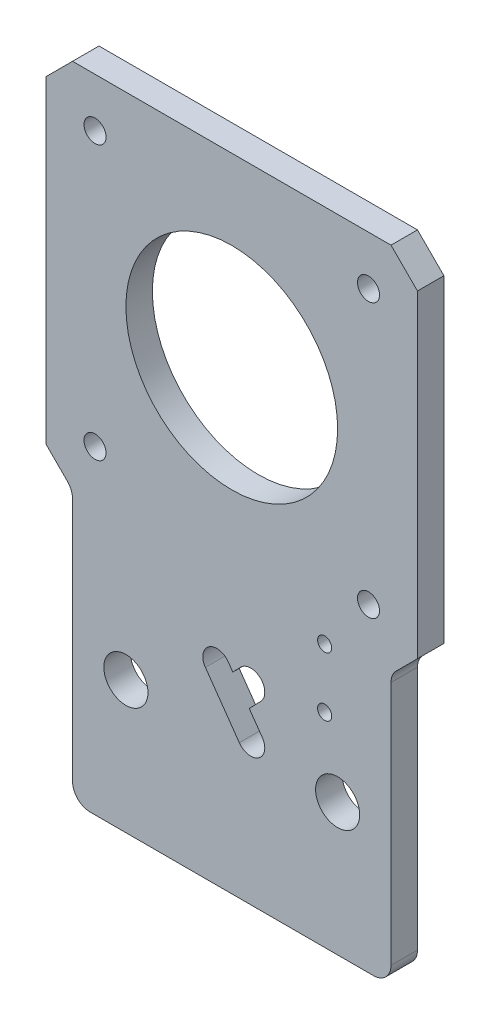
ISO-10303-21;
HEADER;
FILE_DESCRIPTION(('STEP AP214'),'2;1');
FILE_NAME('part.step','',(''),(''),'','','');
FILE_SCHEMA(('AUTOMOTIVE_DESIGN { 1 0 10303 214 1 1 1 1 }'));
ENDSEC;
DATA;
#1=APPLICATION_CONTEXT('core data for automotive mechanical design processes');
#2=APPLICATION_PROTOCOL_DEFINITION('international standard','automotive_design',2000,#1);
#3=PRODUCT_CONTEXT('',#1,'mechanical');
#4=PRODUCT('Part','Part','',(#3));
#5=PRODUCT_RELATED_PRODUCT_CATEGORY('part','',(#4));
#6=PRODUCT_DEFINITION_FORMATION('','',#4);
#7=PRODUCT_DEFINITION_CONTEXT('part definition',#1,'design');
#8=PRODUCT_DEFINITION('design','',#6,#7);
#9=PRODUCT_DEFINITION_SHAPE('','',#8);
#10=(LENGTH_UNIT() NAMED_UNIT(*) SI_UNIT(.MILLI.,.METRE.));
#11=(NAMED_UNIT(*) PLANE_ANGLE_UNIT() SI_UNIT($,.RADIAN.));
#12=(NAMED_UNIT(*) SI_UNIT($,.STERADIAN.) SOLID_ANGLE_UNIT());
#13=UNCERTAINTY_MEASURE_WITH_UNIT(LENGTH_MEASURE(1.E-05),#10,'distance_accuracy_value','');
#14=(GEOMETRIC_REPRESENTATION_CONTEXT(3) GLOBAL_UNCERTAINTY_ASSIGNED_CONTEXT((#13)) GLOBAL_UNIT_ASSIGNED_CONTEXT((#10,
#11,#12)) REPRESENTATION_CONTEXT('',''));
#15=CARTESIAN_POINT('',(0.,0.,0.));
#16=DIRECTION('',(0.,0.,1.));
#17=DIRECTION('',(1.,0.,0.));
#18=AXIS2_PLACEMENT_3D('',#15,#16,#17);
#19=CARTESIAN_POINT('',(0.,0.,3.));
#20=DIRECTION('',(0.,0.,-1.));
#21=DIRECTION('',(-1.,0.,0.));
#22=AXIS2_PLACEMENT_3D('',#19,#20,#21);
#23=PLANE('',#22);
#24=CARTESIAN_POINT('',(0.,-1.11022302462516E-13,3.));
#25=DIRECTION('',(0.,0.,1.));
#26=DIRECTION('',(1.,0.,0.));
#27=AXIS2_PLACEMENT_3D('',#24,#25,#26);
#28=CIRCLE('',#27,12.);
#29=CARTESIAN_POINT('',(12.,-1.11022302462516E-13,3.));
#30=VERTEX_POINT('',#29);
#31=EDGE_CURVE('E295',#30,#30,#28,.T.);
#32=ORIENTED_EDGE('',*,*,#31,.F.);
#33=EDGE_LOOP('',(#32));
#34=FACE_BOUND('',#33,.T.);
#35=DIRECTION('',(1.,0.,0.));
#36=VECTOR('',#35,1.);
#37=CARTESIAN_POINT('',(18.05,-51.6550000000001,3.));
#38=LINE('',#37,#36);
#39=CARTESIAN_POINT('',(-16.05,-51.6550000000001,3.));
#40=VERTEX_POINT('',#39);
#41=CARTESIAN_POINT('',(16.05,-51.6550000000001,3.));
#42=VERTEX_POINT('',#41);
#43=EDGE_CURVE('E311',#40,#42,#38,.T.);
#44=ORIENTED_EDGE('',*,*,#43,.T.);
#45=CARTESIAN_POINT('',(16.05,-49.6550000000001,3.));
#46=DIRECTION('',(0.,0.,-1.));
#47=DIRECTION('',(-1.,0.,0.));
#48=AXIS2_PLACEMENT_3D('',#45,#46,#47);
#49=CIRCLE('',#48,2.);
#50=CARTESIAN_POINT('',(18.05,-49.6550000000001,3.));
#51=VERTEX_POINT('',#50);
#52=EDGE_CURVE('E389',#42,#51,#49,.F.);
#53=ORIENTED_EDGE('',*,*,#52,.T.);
#54=DIRECTION('',(0.,1.,0.));
#55=VECTOR('',#54,1.);
#56=CARTESIAN_POINT('',(18.05,-51.6550000000001,3.));
#57=LINE('',#56,#55);
#58=CARTESIAN_POINT('',(18.05,-21.8784271247463,3.));
#59=VERTEX_POINT('',#58);
#60=EDGE_CURVE('E314',#51,#59,#57,.T.);
#61=ORIENTED_EDGE('',*,*,#60,.T.);
#62=CARTESIAN_POINT('',(20.05,-21.8784271247463,3.));
#63=DIRECTION('',(0.,0.,-1.));
#64=DIRECTION('',(-1.,0.,0.));
#65=AXIS2_PLACEMENT_3D('',#62,#63,#64);
#66=CIRCLE('',#65,2.);
#67=CARTESIAN_POINT('',(18.6357864376269,-20.4642135623732,3.));
#68=VERTEX_POINT('',#67);
#69=EDGE_CURVE('E400',#59,#68,#66,.T.);
#70=ORIENTED_EDGE('',*,*,#69,.T.);
#71=DIRECTION('',(0.707106781186547,0.707106781186548,0.));
#72=VECTOR('',#71,1.);
#73=CARTESIAN_POINT('',(18.05,-21.0500000000001,3.));
#74=LINE('',#73,#72);
#75=CARTESIAN_POINT('',(21.05,-18.0500000000001,3.));
#76=VERTEX_POINT('',#75);
#77=EDGE_CURVE('E317',#68,#76,#74,.T.);
#78=ORIENTED_EDGE('',*,*,#77,.T.);
#79=DIRECTION('',(0.,1.,0.));
#80=VECTOR('',#79,1.);
#81=CARTESIAN_POINT('',(21.05,-18.0500000000001,3.));
#82=LINE('',#81,#80);
#83=CARTESIAN_POINT('',(21.05,18.0499999999999,3.));
#84=VERTEX_POINT('',#83);
#85=EDGE_CURVE('E319',#76,#84,#82,.T.);
#86=ORIENTED_EDGE('',*,*,#85,.T.);
#87=DIRECTION('',(-0.707106781186547,0.707106781186548,0.));
#88=VECTOR('',#87,1.);
#89=CARTESIAN_POINT('',(21.05,18.0499999999999,3.));
#90=LINE('',#89,#88);
#91=CARTESIAN_POINT('',(18.05,21.0499999999999,3.));
#92=VERTEX_POINT('',#91);
#93=EDGE_CURVE('E321',#84,#92,#90,.T.);
#94=ORIENTED_EDGE('',*,*,#93,.T.);
#95=DIRECTION('',(-1.,0.,0.));
#96=VECTOR('',#95,1.);
#97=CARTESIAN_POINT('',(18.05,21.0499999999999,3.));
#98=LINE('',#97,#96);
#99=CARTESIAN_POINT('',(-18.05,21.0499999999999,3.));
#100=VERTEX_POINT('',#99);
#101=EDGE_CURVE('E323',#92,#100,#98,.T.);
#102=ORIENTED_EDGE('',*,*,#101,.T.);
#103=DIRECTION('',(-0.707106781186547,-0.707106781186548,0.));
#104=VECTOR('',#103,1.);
#105=CARTESIAN_POINT('',(-18.05,21.0499999999999,3.));
#106=LINE('',#105,#104);
#107=CARTESIAN_POINT('',(-21.05,18.0499999999999,3.));
#108=VERTEX_POINT('',#107);
#109=EDGE_CURVE('E325',#100,#108,#106,.T.);
#110=ORIENTED_EDGE('',*,*,#109,.T.);
#111=DIRECTION('',(0.,-1.,0.));
#112=VECTOR('',#111,1.);
#113=CARTESIAN_POINT('',(-21.05,18.0499999999999,3.));
#114=LINE('',#113,#112);
#115=CARTESIAN_POINT('',(-21.05,-18.0500000000001,3.));
#116=VERTEX_POINT('',#115);
#117=EDGE_CURVE('E301',#108,#116,#114,.T.);
#118=ORIENTED_EDGE('',*,*,#117,.T.);
#119=DIRECTION('',(0.707106781186548,-0.707106781186548,0.));
#120=VECTOR('',#119,1.);
#121=CARTESIAN_POINT('',(-21.05,-18.0500000000001,3.));
#122=LINE('',#121,#120);
#123=CARTESIAN_POINT('',(-18.6357864376269,-20.4642135623732,3.));
#124=VERTEX_POINT('',#123);
#125=EDGE_CURVE('E304',#116,#124,#122,.T.);
#126=ORIENTED_EDGE('',*,*,#125,.T.);
#127=CARTESIAN_POINT('',(-20.05,-21.8784271247463,3.));
#128=DIRECTION('',(0.,0.,-1.));
#129=DIRECTION('',(-1.,0.,0.));
#130=AXIS2_PLACEMENT_3D('',#127,#128,#129);
#131=CIRCLE('',#130,2.);
#132=CARTESIAN_POINT('',(-18.05,-21.8784271247463,3.));
#133=VERTEX_POINT('',#132);
#134=EDGE_CURVE('E12',#124,#133,#131,.T.);
#135=ORIENTED_EDGE('',*,*,#134,.T.);
#136=DIRECTION('',(0.,-1.,0.));
#137=VECTOR('',#136,1.);
#138=CARTESIAN_POINT('',(-18.05,-51.6550000000001,3.));
#139=LINE('',#138,#137);
#140=CARTESIAN_POINT('',(-18.05,-49.6550000000001,3.));
#141=VERTEX_POINT('',#140);
#142=EDGE_CURVE('E308',#133,#141,#139,.T.);
#143=ORIENTED_EDGE('',*,*,#142,.T.);
#144=CARTESIAN_POINT('',(-16.05,-49.6550000000001,3.));
#145=DIRECTION('',(0.,0.,-1.));
#146=DIRECTION('',(-1.,0.,0.));
#147=AXIS2_PLACEMENT_3D('',#144,#145,#146);
#148=CIRCLE('',#147,2.);
#149=EDGE_CURVE('E387',#141,#40,#148,.F.);
#150=ORIENTED_EDGE('',*,*,#149,.T.);
#151=EDGE_LOOP('',(#44,#53,#61,#70,#78,#86,#94,#102,#110,#118,#126,#135,#143,#150));
#152=FACE_BOUND('',#151,.T.);
#153=CARTESIAN_POINT('',(15.5,-15.5000000000001,3.));
#154=DIRECTION('',(0.,0.,1.));
#155=DIRECTION('',(1.,0.,0.));
#156=AXIS2_PLACEMENT_3D('',#153,#154,#155);
#157=CIRCLE('',#156,1.24999999999999);
#158=CARTESIAN_POINT('',(16.75,-15.5000000000001,3.));
#159=VERTEX_POINT('',#158);
#160=EDGE_CURVE('E288',#159,#159,#157,.T.);
#161=ORIENTED_EDGE('',*,*,#160,.F.);
#162=EDGE_LOOP('',(#161));
#163=FACE_BOUND('',#162,.T.);
#164=CARTESIAN_POINT('',(-15.5,-15.5000000000001,3.));
#165=DIRECTION('',(0.,0.,1.));
#166=DIRECTION('',(1.,0.,0.));
#167=AXIS2_PLACEMENT_3D('',#164,#165,#166);
#168=CIRCLE('',#167,1.24999999999999);
#169=CARTESIAN_POINT('',(-14.25,-15.5000000000001,3.));
#170=VERTEX_POINT('',#169);
#171=EDGE_CURVE('E282',#170,#170,#168,.T.);
#172=ORIENTED_EDGE('',*,*,#171,.F.);
#173=EDGE_LOOP('',(#172));
#174=FACE_BOUND('',#173,.T.);
#175=CARTESIAN_POINT('',(15.5,15.4999999999999,3.));
#176=DIRECTION('',(0.,0.,1.));
#177=DIRECTION('',(1.,0.,0.));
#178=AXIS2_PLACEMENT_3D('',#175,#176,#177);
#179=CIRCLE('',#178,1.24999999999999);
#180=CARTESIAN_POINT('',(16.75,15.4999999999999,3.));
#181=VERTEX_POINT('',#180);
#182=EDGE_CURVE('E276',#181,#181,#179,.T.);
#183=ORIENTED_EDGE('',*,*,#182,.F.);
#184=EDGE_LOOP('',(#183));
#185=FACE_BOUND('',#184,.T.);
#186=CARTESIAN_POINT('',(-15.5,15.4999999999999,3.));
#187=DIRECTION('',(0.,0.,1.));
#188=DIRECTION('',(1.,0.,0.));
#189=AXIS2_PLACEMENT_3D('',#186,#187,#188);
#190=CIRCLE('',#189,1.24999999999999);
#191=CARTESIAN_POINT('',(-14.25,15.4999999999999,3.));
#192=VERTEX_POINT('',#191);
#193=EDGE_CURVE('E270',#192,#192,#190,.T.);
#194=ORIENTED_EDGE('',*,*,#193,.F.);
#195=EDGE_LOOP('',(#194));
#196=FACE_BOUND('',#195,.T.);
#197=CARTESIAN_POINT('',(-12.,-36.655,3.));
#198=DIRECTION('',(0.,0.,1.));
#199=DIRECTION('',(1.,0.,0.));
#200=AXIS2_PLACEMENT_3D('',#197,#198,#199);
#201=CIRCLE('',#200,2.5);
#202=CARTESIAN_POINT('',(-9.50000000000001,-36.655,3.));
#203=VERTEX_POINT('',#202);
#204=EDGE_CURVE('E266',#203,#203,#201,.T.);
#205=ORIENTED_EDGE('',*,*,#204,.F.);
#206=EDGE_LOOP('',(#205));
#207=FACE_BOUND('',#206,.T.);
#208=CARTESIAN_POINT('',(12.,-36.655,3.));
#209=DIRECTION('',(0.,0.,1.));
#210=DIRECTION('',(1.,0.,0.));
#211=AXIS2_PLACEMENT_3D('',#208,#209,#210);
#212=CIRCLE('',#211,2.5);
#213=CARTESIAN_POINT('',(14.5,-36.655,3.));
#214=VERTEX_POINT('',#213);
#215=EDGE_CURVE('E260',#214,#214,#212,.T.);
#216=ORIENTED_EDGE('',*,*,#215,.F.);
#217=EDGE_LOOP('',(#216));
#218=FACE_BOUND('',#217,.T.);
#219=CARTESIAN_POINT('',(10.5294560297045,-28.5613101499908,3.));
#220=DIRECTION('',(0.,0.,1.));
#221=DIRECTION('',(1.,0.,0.));
#222=AXIS2_PLACEMENT_3D('',#219,#220,#221);
#223=CIRCLE('',#222,0.799999999999999);
#224=CARTESIAN_POINT('',(11.3294560297045,-28.5613101499908,3.));
#225=VERTEX_POINT('',#224);
#226=EDGE_CURVE('E254',#225,#225,#223,.T.);
#227=ORIENTED_EDGE('',*,*,#226,.F.);
#228=EDGE_LOOP('',(#227));
#229=FACE_BOUND('',#228,.T.);
#230=CARTESIAN_POINT('',(10.5294560297045,-21.8613101499908,3.));
#231=DIRECTION('',(0.,0.,1.));
#232=DIRECTION('',(1.,0.,0.));
#233=AXIS2_PLACEMENT_3D('',#230,#231,#232);
#234=CIRCLE('',#233,0.799999999999999);
#235=CARTESIAN_POINT('',(11.3294560297045,-21.8613101499908,3.));
#236=VERTEX_POINT('',#235);
#237=EDGE_CURVE('E248',#236,#236,#234,.T.);
#238=ORIENTED_EDGE('',*,*,#237,.F.);
#239=EDGE_LOOP('',(#238));
#240=FACE_BOUND('',#239,.T.);
#241=DIRECTION('',(-0.695871837489852,-0.718165987629947,0.));
#242=VECTOR('',#241,1.);
#243=CARTESIAN_POINT('',(14.9640555731298,-14.4995238250404,3.));
#244=LINE('',#243,#242);
#245=CARTESIAN_POINT('',(1.01381546832237,-28.8966978774966,3.));
#246=VERTEX_POINT('',#245);
#247=CARTESIAN_POINT('',(0.119454203656489,-29.8197124418647,3.));
#248=VERTEX_POINT('',#247);
#249=EDGE_CURVE('E246',#246,#248,#244,.T.);
#250=ORIENTED_EDGE('',*,*,#249,.F.);
#251=CARTESIAN_POINT('',(2.15390397368492,-30.0013944195117,3.));
#252=DIRECTION('',(0.,0.,-1.));
#253=DIRECTION('',(-1.,0.,0.));
#254=AXIS2_PLACEMENT_3D('',#251,#252,#253);
#255=CIRCLE('',#254,1.58749999999999);
#256=CARTESIAN_POINT('',(3.29399247904748,-31.1060909615268,3.));
#257=VERTEX_POINT('',#256);
#258=EDGE_CURVE('E219',#246,#257,#255,.T.);
#259=ORIENTED_EDGE('',*,*,#258,.T.);
#260=DIRECTION('',(-0.695871837489838,-0.718165987629961,0.));
#261=VECTOR('',#260,1.);
#262=CARTESIAN_POINT('',(17.2442325838549,-16.70891690907,3.));
#263=LINE('',#262,#261);
#264=CARTESIAN_POINT('',(1.97851635544013,-32.4637119466236,3.));
#265=VERTEX_POINT('',#264);
#266=EDGE_CURVE('E187',#257,#265,#263,.T.);
#267=ORIENTED_EDGE('',*,*,#266,.T.);
#268=DIRECTION('',(0.575176751990258,-0.81802915838614,0.));
#269=VECTOR('',#268,1.);
#270=CARTESIAN_POINT('',(-13.9505779144574,-9.80900009610289,3.));
#271=LINE('',#270,#269);
#272=CARTESIAN_POINT('',(3.45252526262293,-34.5600801701725,3.));
#273=VERTEX_POINT('',#272);
#274=EDGE_CURVE('E232',#265,#273,#271,.T.);
#275=ORIENTED_EDGE('',*,*,#274,.T.);
#276=CARTESIAN_POINT('',(2.15390397368493,-35.473173263957,3.));
#277=DIRECTION('',(0.,0.,-1.));
#278=DIRECTION('',(-1.,0.,0.));
#279=AXIS2_PLACEMENT_3D('',#276,#277,#278);
#280=CIRCLE('',#279,1.58749999999999);
#281=CARTESIAN_POINT('',(0.855282684746956,-36.3862663577416,3.));
#282=VERTEX_POINT('',#281);
#283=EDGE_CURVE('E235',#273,#282,#280,.T.);
#284=ORIENTED_EDGE('',*,*,#283,.T.);
#285=DIRECTION('',(0.575176751990257,-0.818029158386141,0.));
#286=VECTOR('',#285,1.);
#287=CARTESIAN_POINT('',(-16.5478204923333,-11.6351862836719,3.));
#288=LINE('',#287,#286);
#289=CARTESIAN_POINT('',(-2.99206181525369,-30.9144875132962,3.));
#290=VERTEX_POINT('',#289);
#291=EDGE_CURVE('E238',#290,#282,#288,.T.);
#292=ORIENTED_EDGE('',*,*,#291,.F.);
#293=CARTESIAN_POINT('',(-1.6934405263157,-30.0013944195117,3.));
#294=DIRECTION('',(0.,0.,-1.));
#295=DIRECTION('',(-1.,0.,0.));
#296=AXIS2_PLACEMENT_3D('',#293,#294,#295);
#297=CIRCLE('',#296,1.58749999999999);
#298=CARTESIAN_POINT('',(-0.394819237377711,-29.0883013257272,3.));
#299=VERTEX_POINT('',#298);
#300=EDGE_CURVE('E240',#290,#299,#297,.T.);
#301=ORIENTED_EDGE('',*,*,#300,.T.);
#302=DIRECTION('',(0.575176751990258,-0.81802915838614,0.));
#303=VECTOR('',#302,1.);
#304=CARTESIAN_POINT('',(-13.9505779144574,-9.80900009610288,3.));
#305=LINE('',#304,#303);
#306=EDGE_CURVE('E243',#299,#248,#305,.T.);
#307=ORIENTED_EDGE('',*,*,#306,.T.);
#308=EDGE_LOOP('',(#250,#259,#267,#275,#284,#292,#301,#307));
#309=FACE_BOUND('',#308,.T.);
#310=ADVANCED_FACE('F33',(#34,#152,#163,#174,#185,#196,#207,#218,#229,#240,#309),#23,.F.);
#311=CARTESIAN_POINT('',(0.,0.,0.));
#312=DIRECTION('',(0.,0.,-1.));
#313=DIRECTION('',(-1.,0.,0.));
#314=AXIS2_PLACEMENT_3D('',#311,#312,#313);
#315=PLANE('',#314);
#316=CARTESIAN_POINT('',(10.5294560297045,-21.8613101499908,0.));
#317=DIRECTION('',(0.,0.,-1.));
#318=DIRECTION('',(-1.,0.,0.));
#319=AXIS2_PLACEMENT_3D('',#316,#317,#318);
#320=CIRCLE('',#319,0.799999999999999);
#321=CARTESIAN_POINT('',(9.72945602970451,-21.8613101499908,0.));
#322=VERTEX_POINT('',#321);
#323=EDGE_CURVE('E251',#322,#322,#320,.T.);
#324=ORIENTED_EDGE('',*,*,#323,.F.);
#325=EDGE_LOOP('',(#324));
#326=FACE_BOUND('',#325,.T.);
#327=CARTESIAN_POINT('',(10.5294560297045,-28.5613101499908,0.));
#328=DIRECTION('',(0.,0.,-1.));
#329=DIRECTION('',(-1.,0.,0.));
#330=AXIS2_PLACEMENT_3D('',#327,#328,#329);
#331=CIRCLE('',#330,0.799999999999999);
#332=CARTESIAN_POINT('',(9.72945602970451,-28.5613101499908,0.));
#333=VERTEX_POINT('',#332);
#334=EDGE_CURVE('E257',#333,#333,#331,.T.);
#335=ORIENTED_EDGE('',*,*,#334,.F.);
#336=EDGE_LOOP('',(#335));
#337=FACE_BOUND('',#336,.T.);
#338=CARTESIAN_POINT('',(12.,-36.655,0.));
#339=DIRECTION('',(0.,0.,-1.));
#340=DIRECTION('',(-1.,0.,0.));
#341=AXIS2_PLACEMENT_3D('',#338,#339,#340);
#342=CIRCLE('',#341,2.5);
#343=CARTESIAN_POINT('',(9.50000000000001,-36.655,0.));
#344=VERTEX_POINT('',#343);
#345=EDGE_CURVE('E263',#344,#344,#342,.T.);
#346=ORIENTED_EDGE('',*,*,#345,.F.);
#347=EDGE_LOOP('',(#346));
#348=FACE_BOUND('',#347,.T.);
#349=CARTESIAN_POINT('',(-12.,-36.655,0.));
#350=DIRECTION('',(0.,0.,-1.));
#351=DIRECTION('',(-1.,0.,0.));
#352=AXIS2_PLACEMENT_3D('',#349,#350,#351);
#353=CIRCLE('',#352,2.5);
#354=CARTESIAN_POINT('',(-14.5,-36.655,0.));
#355=VERTEX_POINT('',#354);
#356=EDGE_CURVE('E269',#355,#355,#353,.T.);
#357=ORIENTED_EDGE('',*,*,#356,.F.);
#358=EDGE_LOOP('',(#357));
#359=FACE_BOUND('',#358,.T.);
#360=CARTESIAN_POINT('',(-15.5,15.4999999999999,0.));
#361=DIRECTION('',(0.,0.,-1.));
#362=DIRECTION('',(-1.,0.,0.));
#363=AXIS2_PLACEMENT_3D('',#360,#361,#362);
#364=CIRCLE('',#363,1.24999999999999);
#365=CARTESIAN_POINT('',(-16.75,15.4999999999999,0.));
#366=VERTEX_POINT('',#365);
#367=EDGE_CURVE('E273',#366,#366,#364,.T.);
#368=ORIENTED_EDGE('',*,*,#367,.F.);
#369=EDGE_LOOP('',(#368));
#370=FACE_BOUND('',#369,.T.);
#371=CARTESIAN_POINT('',(15.5,15.4999999999999,0.));
#372=DIRECTION('',(0.,0.,-1.));
#373=DIRECTION('',(-1.,0.,0.));
#374=AXIS2_PLACEMENT_3D('',#371,#372,#373);
#375=CIRCLE('',#374,1.24999999999999);
#376=CARTESIAN_POINT('',(14.25,15.4999999999999,0.));
#377=VERTEX_POINT('',#376);
#378=EDGE_CURVE('E279',#377,#377,#375,.T.);
#379=ORIENTED_EDGE('',*,*,#378,.F.);
#380=EDGE_LOOP('',(#379));
#381=FACE_BOUND('',#380,.T.);
#382=CARTESIAN_POINT('',(-15.5,-15.5000000000001,0.));
#383=DIRECTION('',(0.,0.,-1.));
#384=DIRECTION('',(-1.,0.,0.));
#385=AXIS2_PLACEMENT_3D('',#382,#383,#384);
#386=CIRCLE('',#385,1.24999999999999);
#387=CARTESIAN_POINT('',(-16.75,-15.5000000000001,0.));
#388=VERTEX_POINT('',#387);
#389=EDGE_CURVE('E285',#388,#388,#386,.T.);
#390=ORIENTED_EDGE('',*,*,#389,.F.);
#391=EDGE_LOOP('',(#390));
#392=FACE_BOUND('',#391,.T.);
#393=CARTESIAN_POINT('',(15.5,-15.5000000000001,0.));
#394=DIRECTION('',(0.,0.,-1.));
#395=DIRECTION('',(-1.,0.,0.));
#396=AXIS2_PLACEMENT_3D('',#393,#394,#395);
#397=CIRCLE('',#396,1.24999999999999);
#398=CARTESIAN_POINT('',(14.25,-15.5000000000001,0.));
#399=VERTEX_POINT('',#398);
#400=EDGE_CURVE('E291',#399,#399,#397,.T.);
#401=ORIENTED_EDGE('',*,*,#400,.F.);
#402=EDGE_LOOP('',(#401));
#403=FACE_BOUND('',#402,.T.);
#404=DIRECTION('',(0.,1.,0.));
#405=VECTOR('',#404,1.);
#406=CARTESIAN_POINT('',(18.05,-51.6550000000001,0.));
#407=LINE('',#406,#405);
#408=CARTESIAN_POINT('',(18.05,-49.6550000000001,0.));
#409=VERTEX_POINT('',#408);
#410=CARTESIAN_POINT('',(18.05,-21.8784271247463,0.));
#411=VERTEX_POINT('',#410);
#412=EDGE_CURVE('E339',#409,#411,#407,.T.);
#413=ORIENTED_EDGE('',*,*,#412,.F.);
#414=CARTESIAN_POINT('',(16.05,-49.6550000000001,0.));
#415=DIRECTION('',(0.,0.,-1.));
#416=DIRECTION('',(-1.,0.,0.));
#417=AXIS2_PLACEMENT_3D('',#414,#415,#416);
#418=CIRCLE('',#417,2.);
#419=CARTESIAN_POINT('',(16.05,-51.6550000000001,0.));
#420=VERTEX_POINT('',#419);
#421=EDGE_CURVE('E380',#409,#420,#418,.T.);
#422=ORIENTED_EDGE('',*,*,#421,.T.);
#423=DIRECTION('',(1.,0.,0.));
#424=VECTOR('',#423,1.);
#425=CARTESIAN_POINT('',(18.05,-51.6550000000001,0.));
#426=LINE('',#425,#424);
#427=CARTESIAN_POINT('',(-16.05,-51.6550000000001,0.));
#428=VERTEX_POINT('',#427);
#429=EDGE_CURVE('E336',#428,#420,#426,.T.);
#430=ORIENTED_EDGE('',*,*,#429,.F.);
#431=CARTESIAN_POINT('',(-16.05,-49.6550000000001,0.));
#432=DIRECTION('',(0.,0.,-1.));
#433=DIRECTION('',(-1.,0.,0.));
#434=AXIS2_PLACEMENT_3D('',#431,#432,#433);
#435=CIRCLE('',#434,2.);
#436=CARTESIAN_POINT('',(-18.05,-49.6550000000001,0.));
#437=VERTEX_POINT('',#436);
#438=EDGE_CURVE('E378',#428,#437,#435,.T.);
#439=ORIENTED_EDGE('',*,*,#438,.T.);
#440=DIRECTION('',(0.,-1.,0.));
#441=VECTOR('',#440,1.);
#442=CARTESIAN_POINT('',(-18.05,-51.6550000000001,0.));
#443=LINE('',#442,#441);
#444=CARTESIAN_POINT('',(-18.05,-21.8784271247463,0.));
#445=VERTEX_POINT('',#444);
#446=EDGE_CURVE('E333',#445,#437,#443,.T.);
#447=ORIENTED_EDGE('',*,*,#446,.F.);
#448=CARTESIAN_POINT('',(-20.05,-21.8784271247463,0.));
#449=DIRECTION('',(0.,0.,-1.));
#450=DIRECTION('',(-1.,0.,0.));
#451=AXIS2_PLACEMENT_3D('',#448,#449,#450);
#452=CIRCLE('',#451,2.);
#453=CARTESIAN_POINT('',(-18.6357864376269,-20.4642135623732,0.));
#454=VERTEX_POINT('',#453);
#455=EDGE_CURVE('E41',#445,#454,#452,.F.);
#456=ORIENTED_EDGE('',*,*,#455,.T.);
#457=DIRECTION('',(0.707106781186548,-0.707106781186548,0.));
#458=VECTOR('',#457,1.);
#459=CARTESIAN_POINT('',(-21.05,-18.0500000000001,0.));
#460=LINE('',#459,#458);
#461=CARTESIAN_POINT('',(-21.05,-18.0500000000001,0.));
#462=VERTEX_POINT('',#461);
#463=EDGE_CURVE('E330',#462,#454,#460,.T.);
#464=ORIENTED_EDGE('',*,*,#463,.F.);
#465=DIRECTION('',(0.,-1.,0.));
#466=VECTOR('',#465,1.);
#467=CARTESIAN_POINT('',(-21.05,18.0499999999999,0.));
#468=LINE('',#467,#466);
#469=CARTESIAN_POINT('',(-21.05,18.0499999999999,0.));
#470=VERTEX_POINT('',#469);
#471=EDGE_CURVE('E298',#470,#462,#468,.T.);
#472=ORIENTED_EDGE('',*,*,#471,.F.);
#473=DIRECTION('',(-0.707106781186547,-0.707106781186548,0.));
#474=VECTOR('',#473,1.);
#475=CARTESIAN_POINT('',(-18.05,21.0499999999999,0.));
#476=LINE('',#475,#474);
#477=CARTESIAN_POINT('',(-18.05,21.0499999999999,0.));
#478=VERTEX_POINT('',#477);
#479=EDGE_CURVE('E305',#478,#470,#476,.T.);
#480=ORIENTED_EDGE('',*,*,#479,.F.);
#481=DIRECTION('',(-1.,0.,0.));
#482=VECTOR('',#481,1.);
#483=CARTESIAN_POINT('',(18.05,21.0499999999999,0.));
#484=LINE('',#483,#482);
#485=CARTESIAN_POINT('',(18.05,21.0499999999999,0.));
#486=VERTEX_POINT('',#485);
#487=EDGE_CURVE('E348',#486,#478,#484,.T.);
#488=ORIENTED_EDGE('',*,*,#487,.F.);
#489=DIRECTION('',(-0.707106781186547,0.707106781186548,0.));
#490=VECTOR('',#489,1.);
#491=CARTESIAN_POINT('',(21.05,18.0499999999999,0.));
#492=LINE('',#491,#490);
#493=CARTESIAN_POINT('',(21.05,18.0499999999999,0.));
#494=VERTEX_POINT('',#493);
#495=EDGE_CURVE('E346',#494,#486,#492,.T.);
#496=ORIENTED_EDGE('',*,*,#495,.F.);
#497=DIRECTION('',(0.,1.,0.));
#498=VECTOR('',#497,1.);
#499=CARTESIAN_POINT('',(21.05,-18.0500000000001,0.));
#500=LINE('',#499,#498);
#501=CARTESIAN_POINT('',(21.05,-18.0500000000001,0.));
#502=VERTEX_POINT('',#501);
#503=EDGE_CURVE('E344',#502,#494,#500,.T.);
#504=ORIENTED_EDGE('',*,*,#503,.F.);
#505=DIRECTION('',(0.707106781186547,0.707106781186548,0.));
#506=VECTOR('',#505,1.);
#507=CARTESIAN_POINT('',(18.05,-21.0500000000001,0.));
#508=LINE('',#507,#506);
#509=CARTESIAN_POINT('',(18.6357864376269,-20.4642135623732,0.));
#510=VERTEX_POINT('',#509);
#511=EDGE_CURVE('E342',#510,#502,#508,.T.);
#512=ORIENTED_EDGE('',*,*,#511,.F.);
#513=CARTESIAN_POINT('',(20.05,-21.8784271247463,0.));
#514=DIRECTION('',(0.,0.,-1.));
#515=DIRECTION('',(-1.,0.,0.));
#516=AXIS2_PLACEMENT_3D('',#513,#514,#515);
#517=CIRCLE('',#516,2.);
#518=EDGE_CURVE('E398',#510,#411,#517,.F.);
#519=ORIENTED_EDGE('',*,*,#518,.T.);
#520=EDGE_LOOP('',(#413,#422,#430,#439,#447,#456,#464,#472,#480,#488,#496,#504,#512,#519));
#521=FACE_BOUND('',#520,.T.);
#522=CARTESIAN_POINT('',(0.,-1.11022302462516E-13,0.));
#523=DIRECTION('',(0.,0.,1.));
#524=DIRECTION('',(1.,0.,0.));
#525=AXIS2_PLACEMENT_3D('',#522,#523,#524);
#526=CIRCLE('',#525,12.);
#527=CARTESIAN_POINT('',(12.,-1.11022302462516E-13,0.));
#528=VERTEX_POINT('',#527);
#529=EDGE_CURVE('E294',#528,#528,#526,.T.);
#530=ORIENTED_EDGE('',*,*,#529,.T.);
#531=EDGE_LOOP('',(#530));
#532=FACE_BOUND('',#531,.T.);
#533=CARTESIAN_POINT('',(2.15390397368492,-30.0013944195117,0.));
#534=DIRECTION('',(0.,0.,-1.));
#535=DIRECTION('',(-1.,0.,0.));
#536=AXIS2_PLACEMENT_3D('',#533,#534,#535);
#537=CIRCLE('',#536,1.58749999999999);
#538=CARTESIAN_POINT('',(1.01381546832236,-28.8966978774966,0.));
#539=VERTEX_POINT('',#538);
#540=CARTESIAN_POINT('',(3.29399247904748,-31.1060909615268,0.));
#541=VERTEX_POINT('',#540);
#542=EDGE_CURVE('E193',#539,#541,#537,.T.);
#543=ORIENTED_EDGE('',*,*,#542,.F.);
#544=DIRECTION('',(-0.695871837489852,-0.718165987629947,0.));
#545=VECTOR('',#544,1.);
#546=CARTESIAN_POINT('',(14.9640555731298,-14.4995238250404,0.));
#547=LINE('',#546,#545);
#548=CARTESIAN_POINT('',(0.119454203656489,-29.8197124418647,0.));
#549=VERTEX_POINT('',#548);
#550=EDGE_CURVE('E56',#539,#549,#547,.T.);
#551=ORIENTED_EDGE('',*,*,#550,.T.);
#552=DIRECTION('',(0.575176751990258,-0.81802915838614,0.));
#553=VECTOR('',#552,1.);
#554=CARTESIAN_POINT('',(-13.9505779144574,-9.80900009610288,0.));
#555=LINE('',#554,#553);
#556=CARTESIAN_POINT('',(-0.394819237377711,-29.0883013257272,0.));
#557=VERTEX_POINT('',#556);
#558=EDGE_CURVE('E214',#557,#549,#555,.T.);
#559=ORIENTED_EDGE('',*,*,#558,.F.);
#560=CARTESIAN_POINT('',(-1.6934405263157,-30.0013944195117,0.));
#561=DIRECTION('',(0.,0.,-1.));
#562=DIRECTION('',(-1.,0.,0.));
#563=AXIS2_PLACEMENT_3D('',#560,#561,#562);
#564=CIRCLE('',#563,1.58749999999999);
#565=CARTESIAN_POINT('',(-2.99206181525369,-30.9144875132962,0.));
#566=VERTEX_POINT('',#565);
#567=EDGE_CURVE('E211',#566,#557,#564,.T.);
#568=ORIENTED_EDGE('',*,*,#567,.F.);
#569=DIRECTION('',(0.575176751990257,-0.818029158386141,0.));
#570=VECTOR('',#569,1.);
#571=CARTESIAN_POINT('',(-16.5478204923333,-11.6351862836719,0.));
#572=LINE('',#571,#570);
#573=CARTESIAN_POINT('',(0.855282684746956,-36.3862663577416,0.));
#574=VERTEX_POINT('',#573);
#575=EDGE_CURVE('E208',#566,#574,#572,.T.);
#576=ORIENTED_EDGE('',*,*,#575,.T.);
#577=CARTESIAN_POINT('',(2.15390397368493,-35.473173263957,0.));
#578=DIRECTION('',(0.,0.,-1.));
#579=DIRECTION('',(-1.,0.,0.));
#580=AXIS2_PLACEMENT_3D('',#577,#578,#579);
#581=CIRCLE('',#580,1.58749999999999);
#582=CARTESIAN_POINT('',(3.45252526262293,-34.5600801701725,0.));
#583=VERTEX_POINT('',#582);
#584=EDGE_CURVE('E202',#583,#574,#581,.T.);
#585=ORIENTED_EDGE('',*,*,#584,.F.);
#586=DIRECTION('',(0.575176751990258,-0.81802915838614,0.));
#587=VECTOR('',#586,1.);
#588=CARTESIAN_POINT('',(-13.9505779144574,-9.80900009610289,0.));
#589=LINE('',#588,#587);
#590=CARTESIAN_POINT('',(1.97851635544013,-32.4637119466236,0.));
#591=VERTEX_POINT('',#590);
#592=EDGE_CURVE('E200',#591,#583,#589,.T.);
#593=ORIENTED_EDGE('',*,*,#592,.F.);
#594=DIRECTION('',(-0.695871837489838,-0.718165987629961,0.));
#595=VECTOR('',#594,1.);
#596=CARTESIAN_POINT('',(17.2442325838549,-16.70891690907,0.));
#597=LINE('',#596,#595);
#598=EDGE_CURVE('E184',#541,#591,#597,.T.);
#599=ORIENTED_EDGE('',*,*,#598,.F.);
#600=EDGE_LOOP('',(#543,#551,#559,#568,#576,#585,#593,#599));
#601=FACE_BOUND('',#600,.T.);
#602=ADVANCED_FACE('F197',(#326,#337,#348,#359,#370,#381,#392,#403,#521,#532,#601),#315,.T.);
#603=CARTESIAN_POINT('',(-21.05,18.0499999999999,3.));
#604=DIRECTION('',(1.,0.,0.));
#605=DIRECTION('',(0.,0.,-1.));
#606=AXIS2_PLACEMENT_3D('',#603,#604,#605);
#607=PLANE('',#606);
#608=ORIENTED_EDGE('',*,*,#471,.T.);
#609=DIRECTION('',(0.,0.,-1.));
#610=VECTOR('',#609,1.);
#611=CARTESIAN_POINT('',(-21.05,-18.0500000000001,3.));
#612=LINE('',#611,#610);
#613=EDGE_CURVE('E365',#116,#462,#612,.T.);
#614=ORIENTED_EDGE('',*,*,#613,.F.);
#615=ORIENTED_EDGE('',*,*,#117,.F.);
#616=DIRECTION('',(0.,0.,-1.));
#617=VECTOR('',#616,1.);
#618=CARTESIAN_POINT('',(-21.05,18.0499999999999,3.));
#619=LINE('',#618,#617);
#620=EDGE_CURVE('E327',#108,#470,#619,.T.);
#621=ORIENTED_EDGE('',*,*,#620,.T.);
#622=EDGE_LOOP('',(#608,#614,#615,#621));
#623=FACE_BOUND('',#622,.T.);
#624=ADVANCED_FACE('F467',(#623),#607,.F.);
#625=CARTESIAN_POINT('',(-21.05,-18.0500000000001,3.));
#626=DIRECTION('',(0.707106781186547,0.707106781186547,0.));
#627=DIRECTION('',(-0.707106781186548,0.707106781186548,0.));
#628=AXIS2_PLACEMENT_3D('',#625,#626,#627);
#629=PLANE('',#628);
#630=ORIENTED_EDGE('',*,*,#463,.T.);
#631=DIRECTION('',(0.,0.,-1.));
#632=VECTOR('',#631,1.);
#633=CARTESIAN_POINT('',(-18.6357864376269,-20.4642135623732,3.));
#634=LINE('',#633,#632);
#635=EDGE_CURVE('E396',#454,#124,#634,.F.);
#636=ORIENTED_EDGE('',*,*,#635,.T.);
#637=ORIENTED_EDGE('',*,*,#125,.F.);
#638=ORIENTED_EDGE('',*,*,#613,.T.);
#639=EDGE_LOOP('',(#630,#636,#637,#638));
#640=FACE_BOUND('',#639,.T.);
#641=ADVANCED_FACE('F410',(#640),#629,.F.);
#642=CARTESIAN_POINT('',(-18.05,-51.6550000000001,3.));
#643=DIRECTION('',(1.,0.,0.));
#644=DIRECTION('',(0.,1.,0.));
#645=AXIS2_PLACEMENT_3D('',#642,#643,#644);
#646=PLANE('',#645);
#647=ORIENTED_EDGE('',*,*,#446,.T.);
#648=DIRECTION('',(0.,0.,-1.));
#649=VECTOR('',#648,1.);
#650=CARTESIAN_POINT('',(-18.05,-49.6550000000001,3.));
#651=LINE('',#650,#649);
#652=EDGE_CURVE('E394',#437,#141,#651,.F.);
#653=ORIENTED_EDGE('',*,*,#652,.T.);
#654=ORIENTED_EDGE('',*,*,#142,.F.);
#655=DIRECTION('',(0.,0.,-1.));
#656=VECTOR('',#655,1.);
#657=CARTESIAN_POINT('',(-18.05,-21.8784271247463,0.));
#658=LINE('',#657,#656);
#659=EDGE_CURVE('E391',#133,#445,#658,.T.);
#660=ORIENTED_EDGE('',*,*,#659,.T.);
#661=EDGE_LOOP('',(#647,#653,#654,#660));
#662=FACE_BOUND('',#661,.T.);
#663=ADVANCED_FACE('F418',(#662),#646,.F.);
#664=CARTESIAN_POINT('',(18.05,-51.6550000000001,3.));
#665=DIRECTION('',(0.,1.,0.));
#666=DIRECTION('',(0.,0.,1.));
#667=AXIS2_PLACEMENT_3D('',#664,#665,#666);
#668=PLANE('',#667);
#669=ORIENTED_EDGE('',*,*,#429,.T.);
#670=DIRECTION('',(0.,0.,-1.));
#671=VECTOR('',#670,1.);
#672=CARTESIAN_POINT('',(16.05,-51.6550000000001,3.));
#673=LINE('',#672,#671);
#674=EDGE_CURVE('E385',#420,#42,#673,.F.);
#675=ORIENTED_EDGE('',*,*,#674,.T.);
#676=ORIENTED_EDGE('',*,*,#43,.F.);
#677=DIRECTION('',(0.,0.,-1.));
#678=VECTOR('',#677,1.);
#679=CARTESIAN_POINT('',(-16.05,-51.6550000000001,3.));
#680=LINE('',#679,#678);
#681=EDGE_CURVE('E382',#40,#428,#680,.T.);
#682=ORIENTED_EDGE('',*,*,#681,.T.);
#683=EDGE_LOOP('',(#669,#675,#676,#682));
#684=FACE_BOUND('',#683,.T.);
#685=ADVANCED_FACE('F426',(#684),#668,.F.);
#686=CARTESIAN_POINT('',(18.05,-51.6550000000001,3.));
#687=DIRECTION('',(-1.,0.,0.));
#688=DIRECTION('',(0.,-1.,0.));
#689=AXIS2_PLACEMENT_3D('',#686,#687,#688);
#690=PLANE('',#689);
#691=ORIENTED_EDGE('',*,*,#412,.T.);
#692=DIRECTION('',(0.,0.,-1.));
#693=VECTOR('',#692,1.);
#694=CARTESIAN_POINT('',(18.05,-21.8784271247463,3.));
#695=LINE('',#694,#693);
#696=EDGE_CURVE('E376',#411,#59,#695,.F.);
#697=ORIENTED_EDGE('',*,*,#696,.T.);
#698=ORIENTED_EDGE('',*,*,#60,.F.);
#699=DIRECTION('',(0.,0.,-1.));
#700=VECTOR('',#699,1.);
#701=CARTESIAN_POINT('',(18.05,-49.6550000000001,3.));
#702=LINE('',#701,#700);
#703=EDGE_CURVE('E373',#51,#409,#702,.T.);
#704=ORIENTED_EDGE('',*,*,#703,.T.);
#705=EDGE_LOOP('',(#691,#697,#698,#704));
#706=FACE_BOUND('',#705,.T.);
#707=ADVANCED_FACE('F435',(#706),#690,.F.);
#708=CARTESIAN_POINT('',(18.05,-21.0500000000001,3.));
#709=DIRECTION('',(-0.707106781186548,0.707106781186547,0.));
#710=DIRECTION('',(-0.707106781186547,-0.707106781186548,0.));
#711=AXIS2_PLACEMENT_3D('',#708,#709,#710);
#712=PLANE('',#711);
#713=ORIENTED_EDGE('',*,*,#77,.F.);
#714=DIRECTION('',(0.,0.,-1.));
#715=VECTOR('',#714,1.);
#716=CARTESIAN_POINT('',(18.6357864376269,-20.4642135623732,0.));
#717=LINE('',#716,#715);
#718=EDGE_CURVE('E368',#68,#510,#717,.T.);
#719=ORIENTED_EDGE('',*,*,#718,.T.);
#720=ORIENTED_EDGE('',*,*,#511,.T.);
#721=DIRECTION('',(0.,0.,-1.));
#722=VECTOR('',#721,1.);
#723=CARTESIAN_POINT('',(21.05,-18.0500000000001,3.));
#724=LINE('',#723,#722);
#725=EDGE_CURVE('E362',#76,#502,#724,.T.);
#726=ORIENTED_EDGE('',*,*,#725,.F.);
#727=EDGE_LOOP('',(#713,#719,#720,#726));
#728=FACE_BOUND('',#727,.T.);
#729=ADVANCED_FACE('F443',(#728),#712,.F.);
#730=CARTESIAN_POINT('',(21.05,-18.0500000000001,3.));
#731=DIRECTION('',(-1.,0.,0.));
#732=DIRECTION('',(0.,0.,1.));
#733=AXIS2_PLACEMENT_3D('',#730,#731,#732);
#734=PLANE('',#733);
#735=ORIENTED_EDGE('',*,*,#503,.T.);
#736=DIRECTION('',(0.,0.,-1.));
#737=VECTOR('',#736,1.);
#738=CARTESIAN_POINT('',(21.05,18.0499999999999,3.));
#739=LINE('',#738,#737);
#740=EDGE_CURVE('E359',#84,#494,#739,.T.);
#741=ORIENTED_EDGE('',*,*,#740,.F.);
#742=ORIENTED_EDGE('',*,*,#85,.F.);
#743=ORIENTED_EDGE('',*,*,#725,.T.);
#744=EDGE_LOOP('',(#735,#741,#742,#743));
#745=FACE_BOUND('',#744,.T.);
#746=ADVANCED_FACE('F449',(#745),#734,.F.);
#747=CARTESIAN_POINT('',(21.05,18.0499999999999,3.));
#748=DIRECTION('',(-0.707106781186548,-0.707106781186547,0.));
#749=DIRECTION('',(0.707106781186547,-0.707106781186548,0.));
#750=AXIS2_PLACEMENT_3D('',#747,#748,#749);
#751=PLANE('',#750);
#752=ORIENTED_EDGE('',*,*,#495,.T.);
#753=DIRECTION('',(0.,0.,-1.));
#754=VECTOR('',#753,1.);
#755=CARTESIAN_POINT('',(18.05,21.0499999999999,3.));
#756=LINE('',#755,#754);
#757=EDGE_CURVE('E356',#92,#486,#756,.T.);
#758=ORIENTED_EDGE('',*,*,#757,.F.);
#759=ORIENTED_EDGE('',*,*,#93,.F.);
#760=ORIENTED_EDGE('',*,*,#740,.T.);
#761=EDGE_LOOP('',(#752,#758,#759,#760));
#762=FACE_BOUND('',#761,.T.);
#763=ADVANCED_FACE('F455',(#762),#751,.F.);
#764=CARTESIAN_POINT('',(18.05,21.0499999999999,3.));
#765=DIRECTION('',(0.,-1.,0.));
#766=DIRECTION('',(0.,0.,-1.));
#767=AXIS2_PLACEMENT_3D('',#764,#765,#766);
#768=PLANE('',#767);
#769=ORIENTED_EDGE('',*,*,#487,.T.);
#770=DIRECTION('',(0.,0.,-1.));
#771=VECTOR('',#770,1.);
#772=CARTESIAN_POINT('',(-18.05,21.0499999999999,3.));
#773=LINE('',#772,#771);
#774=EDGE_CURVE('E353',#100,#478,#773,.T.);
#775=ORIENTED_EDGE('',*,*,#774,.F.);
#776=ORIENTED_EDGE('',*,*,#101,.F.);
#777=ORIENTED_EDGE('',*,*,#757,.T.);
#778=EDGE_LOOP('',(#769,#775,#776,#777));
#779=FACE_BOUND('',#778,.T.);
#780=ADVANCED_FACE('F459',(#779),#768,.F.);
#781=CARTESIAN_POINT('',(-18.05,21.0499999999999,3.));
#782=DIRECTION('',(0.707106781186548,-0.707106781186547,0.));
#783=DIRECTION('',(0.707106781186547,0.707106781186548,0.));
#784=AXIS2_PLACEMENT_3D('',#781,#782,#783);
#785=PLANE('',#784);
#786=ORIENTED_EDGE('',*,*,#479,.T.);
#787=ORIENTED_EDGE('',*,*,#620,.F.);
#788=ORIENTED_EDGE('',*,*,#109,.F.);
#789=ORIENTED_EDGE('',*,*,#774,.T.);
#790=EDGE_LOOP('',(#786,#787,#788,#789));
#791=FACE_BOUND('',#790,.T.);
#792=ADVANCED_FACE('F464',(#791),#785,.F.);
#793=CARTESIAN_POINT('',(0.,-1.11022302462516E-13,3.));
#794=DIRECTION('',(0.,0.,-1.));
#795=DIRECTION('',(-1.,0.,0.));
#796=AXIS2_PLACEMENT_3D('',#793,#794,#795);
#797=CYLINDRICAL_SURFACE('',#796,12.);
#798=ORIENTED_EDGE('',*,*,#31,.T.);
#799=EDGE_LOOP('',(#798));
#800=FACE_BOUND('',#799,.T.);
#801=ORIENTED_EDGE('',*,*,#529,.F.);
#802=EDGE_LOOP('',(#801));
#803=FACE_BOUND('',#802,.T.);
#804=ADVANCED_FACE('F485',(#800,#803),#797,.F.);
#805=CARTESIAN_POINT('',(15.5,-15.5000000000001,3.));
#806=DIRECTION('',(0.,0.,1.));
#807=DIRECTION('',(1.,0.,0.));
#808=AXIS2_PLACEMENT_3D('',#805,#806,#807);
#809=CYLINDRICAL_SURFACE('',#808,1.24999999999999);
#810=ORIENTED_EDGE('',*,*,#400,.T.);
#811=EDGE_LOOP('',(#810));
#812=FACE_BOUND('',#811,.T.);
#813=ORIENTED_EDGE('',*,*,#160,.T.);
#814=EDGE_LOOP('',(#813));
#815=FACE_BOUND('',#814,.T.);
#816=ADVANCED_FACE('F542',(#812,#815),#809,.F.);
#817=CARTESIAN_POINT('',(-15.5,-15.5000000000001,3.));
#818=DIRECTION('',(0.,0.,1.));
#819=DIRECTION('',(1.,0.,0.));
#820=AXIS2_PLACEMENT_3D('',#817,#818,#819);
#821=CYLINDRICAL_SURFACE('',#820,1.24999999999999);
#822=ORIENTED_EDGE('',*,*,#389,.T.);
#823=EDGE_LOOP('',(#822));
#824=FACE_BOUND('',#823,.T.);
#825=ORIENTED_EDGE('',*,*,#171,.T.);
#826=EDGE_LOOP('',(#825));
#827=FACE_BOUND('',#826,.T.);
#828=ADVANCED_FACE('F549',(#824,#827),#821,.F.);
#829=CARTESIAN_POINT('',(15.5,15.4999999999999,3.));
#830=DIRECTION('',(0.,0.,1.));
#831=DIRECTION('',(1.,0.,0.));
#832=AXIS2_PLACEMENT_3D('',#829,#830,#831);
#833=CYLINDRICAL_SURFACE('',#832,1.24999999999999);
#834=ORIENTED_EDGE('',*,*,#378,.T.);
#835=EDGE_LOOP('',(#834));
#836=FACE_BOUND('',#835,.T.);
#837=ORIENTED_EDGE('',*,*,#182,.T.);
#838=EDGE_LOOP('',(#837));
#839=FACE_BOUND('',#838,.T.);
#840=ADVANCED_FACE('F556',(#836,#839),#833,.F.);
#841=CARTESIAN_POINT('',(-15.5,15.4999999999999,3.));
#842=DIRECTION('',(0.,0.,1.));
#843=DIRECTION('',(1.,0.,0.));
#844=AXIS2_PLACEMENT_3D('',#841,#842,#843);
#845=CYLINDRICAL_SURFACE('',#844,1.24999999999999);
#846=ORIENTED_EDGE('',*,*,#367,.T.);
#847=EDGE_LOOP('',(#846));
#848=FACE_BOUND('',#847,.T.);
#849=ORIENTED_EDGE('',*,*,#193,.T.);
#850=EDGE_LOOP('',(#849));
#851=FACE_BOUND('',#850,.T.);
#852=ADVANCED_FACE('F564',(#848,#851),#845,.F.);
#853=CARTESIAN_POINT('',(-12.,-36.655,3.));
#854=DIRECTION('',(0.,0.,1.));
#855=DIRECTION('',(1.,0.,0.));
#856=AXIS2_PLACEMENT_3D('',#853,#854,#855);
#857=CYLINDRICAL_SURFACE('',#856,2.5);
#858=ORIENTED_EDGE('',*,*,#356,.T.);
#859=EDGE_LOOP('',(#858));
#860=FACE_BOUND('',#859,.T.);
#861=ORIENTED_EDGE('',*,*,#204,.T.);
#862=EDGE_LOOP('',(#861));
#863=FACE_BOUND('',#862,.T.);
#864=ADVANCED_FACE('F572',(#860,#863),#857,.F.);
#865=CARTESIAN_POINT('',(12.,-36.655,3.));
#866=DIRECTION('',(0.,0.,1.));
#867=DIRECTION('',(1.,0.,0.));
#868=AXIS2_PLACEMENT_3D('',#865,#866,#867);
#869=CYLINDRICAL_SURFACE('',#868,2.5);
#870=ORIENTED_EDGE('',*,*,#345,.T.);
#871=EDGE_LOOP('',(#870));
#872=FACE_BOUND('',#871,.T.);
#873=ORIENTED_EDGE('',*,*,#215,.T.);
#874=EDGE_LOOP('',(#873));
#875=FACE_BOUND('',#874,.T.);
#876=ADVANCED_FACE('F580',(#872,#875),#869,.F.);
#877=CARTESIAN_POINT('',(20.05,-21.8784271247463,3.));
#878=DIRECTION('',(0.,0.,1.));
#879=DIRECTION('',(1.,0.,0.));
#880=AXIS2_PLACEMENT_3D('',#877,#878,#879);
#881=CYLINDRICAL_SURFACE('',#880,2.);
#882=ORIENTED_EDGE('',*,*,#69,.F.);
#883=ORIENTED_EDGE('',*,*,#696,.F.);
#884=ORIENTED_EDGE('',*,*,#518,.F.);
#885=ORIENTED_EDGE('',*,*,#718,.F.);
#886=EDGE_LOOP('',(#882,#883,#884,#885));
#887=FACE_BOUND('',#886,.T.);
#888=ADVANCED_FACE('F438',(#887),#881,.F.);
#889=CARTESIAN_POINT('',(16.05,-49.6550000000001,3.));
#890=DIRECTION('',(0.,0.,-1.));
#891=DIRECTION('',(-1.,0.,0.));
#892=AXIS2_PLACEMENT_3D('',#889,#890,#891);
#893=CYLINDRICAL_SURFACE('',#892,2.);
#894=ORIENTED_EDGE('',*,*,#52,.F.);
#895=ORIENTED_EDGE('',*,*,#674,.F.);
#896=ORIENTED_EDGE('',*,*,#421,.F.);
#897=ORIENTED_EDGE('',*,*,#703,.F.);
#898=EDGE_LOOP('',(#894,#895,#896,#897));
#899=FACE_BOUND('',#898,.T.);
#900=ADVANCED_FACE('F430',(#899),#893,.T.);
#901=CARTESIAN_POINT('',(-16.05,-49.6550000000001,3.));
#902=DIRECTION('',(0.,0.,-1.));
#903=DIRECTION('',(-1.,0.,0.));
#904=AXIS2_PLACEMENT_3D('',#901,#902,#903);
#905=CYLINDRICAL_SURFACE('',#904,2.);
#906=ORIENTED_EDGE('',*,*,#149,.F.);
#907=ORIENTED_EDGE('',*,*,#652,.F.);
#908=ORIENTED_EDGE('',*,*,#438,.F.);
#909=ORIENTED_EDGE('',*,*,#681,.F.);
#910=EDGE_LOOP('',(#906,#907,#908,#909));
#911=FACE_BOUND('',#910,.T.);
#912=ADVANCED_FACE('F421',(#911),#905,.T.);
#913=CARTESIAN_POINT('',(-20.05,-21.8784271247463,3.));
#914=DIRECTION('',(0.,0.,1.));
#915=DIRECTION('',(1.,0.,0.));
#916=AXIS2_PLACEMENT_3D('',#913,#914,#915);
#917=CYLINDRICAL_SURFACE('',#916,2.);
#918=ORIENTED_EDGE('',*,*,#134,.F.);
#919=ORIENTED_EDGE('',*,*,#635,.F.);
#920=ORIENTED_EDGE('',*,*,#455,.F.);
#921=ORIENTED_EDGE('',*,*,#659,.F.);
#922=EDGE_LOOP('',(#918,#919,#920,#921));
#923=FACE_BOUND('',#922,.T.);
#924=ADVANCED_FACE('F35',(#923),#917,.F.);
#925=CARTESIAN_POINT('',(10.5294560297045,-28.5613101499908,3.));
#926=DIRECTION('',(0.,0.,1.));
#927=DIRECTION('',(1.,0.,0.));
#928=AXIS2_PLACEMENT_3D('',#925,#926,#927);
#929=CYLINDRICAL_SURFACE('',#928,0.799999999999999);
#930=ORIENTED_EDGE('',*,*,#334,.T.);
#931=EDGE_LOOP('',(#930));
#932=FACE_BOUND('',#931,.T.);
#933=ORIENTED_EDGE('',*,*,#226,.T.);
#934=EDGE_LOOP('',(#933));
#935=FACE_BOUND('',#934,.T.);
#936=ADVANCED_FACE('F610',(#932,#935),#929,.F.);
#937=CARTESIAN_POINT('',(10.5294560297045,-21.8613101499908,3.));
#938=DIRECTION('',(0.,0.,1.));
#939=DIRECTION('',(1.,0.,0.));
#940=AXIS2_PLACEMENT_3D('',#937,#938,#939);
#941=CYLINDRICAL_SURFACE('',#940,0.799999999999999);
#942=ORIENTED_EDGE('',*,*,#323,.T.);
#943=EDGE_LOOP('',(#942));
#944=FACE_BOUND('',#943,.T.);
#945=ORIENTED_EDGE('',*,*,#237,.T.);
#946=EDGE_LOOP('',(#945));
#947=FACE_BOUND('',#946,.T.);
#948=ADVANCED_FACE('F616',(#944,#947),#941,.F.);
#949=CARTESIAN_POINT('',(14.9640555731298,-14.4995238250404,10.));
#950=DIRECTION('',(0.718165987629947,-0.695871837489852,0.));
#951=DIRECTION('',(0.695871837489852,0.718165987629947,0.));
#952=AXIS2_PLACEMENT_3D('',#949,#950,#951);
#953=PLANE('',#952);
#954=ORIENTED_EDGE('',*,*,#249,.T.);
#955=DIRECTION('',(0.,0.,-1.));
#956=VECTOR('',#955,1.);
#957=CARTESIAN_POINT('',(0.119454203656489,-29.8197124418647,10.));
#958=LINE('',#957,#956);
#959=EDGE_CURVE('E217',#248,#549,#958,.T.);
#960=ORIENTED_EDGE('',*,*,#959,.T.);
#961=ORIENTED_EDGE('',*,*,#550,.F.);
#962=DIRECTION('',(0.,0.,-1.));
#963=VECTOR('',#962,1.);
#964=CARTESIAN_POINT('',(1.01381546832237,-28.8966978774966,10.));
#965=LINE('',#964,#963);
#966=EDGE_CURVE('E190',#246,#539,#965,.T.);
#967=ORIENTED_EDGE('',*,*,#966,.F.);
#968=EDGE_LOOP('',(#954,#960,#961,#967));
#969=FACE_BOUND('',#968,.T.);
#970=ADVANCED_FACE('F624',(#969),#953,.T.);
#971=CARTESIAN_POINT('',(-13.9505779144574,-9.80900009610288,10.));
#972=DIRECTION('',(0.81802915838614,0.575176751990258,0.));
#973=DIRECTION('',(-0.575176751990258,0.81802915838614,0.));
#974=AXIS2_PLACEMENT_3D('',#971,#972,#973);
#975=PLANE('',#974);
#976=DIRECTION('',(0.,0.,-1.));
#977=VECTOR('',#976,1.);
#978=CARTESIAN_POINT('',(-0.394819237377711,-29.0883013257272,10.));
#979=LINE('',#978,#977);
#980=EDGE_CURVE('E220',#299,#557,#979,.T.);
#981=ORIENTED_EDGE('',*,*,#980,.T.);
#982=ORIENTED_EDGE('',*,*,#558,.T.);
#983=ORIENTED_EDGE('',*,*,#959,.F.);
#984=ORIENTED_EDGE('',*,*,#306,.F.);
#985=EDGE_LOOP('',(#981,#982,#983,#984));
#986=FACE_BOUND('',#985,.T.);
#987=ADVANCED_FACE('F632',(#986),#975,.F.);
#988=CARTESIAN_POINT('',(-1.6934405263157,-30.0013944195117,10.));
#989=DIRECTION('',(0.,0.,-1.));
#990=DIRECTION('',(-1.,0.,0.));
#991=AXIS2_PLACEMENT_3D('',#988,#989,#990);
#992=CYLINDRICAL_SURFACE('',#991,1.58749999999999);
#993=DIRECTION('',(0.,0.,-1.));
#994=VECTOR('',#993,1.);
#995=CARTESIAN_POINT('',(-2.99206181525369,-30.9144875132962,10.));
#996=LINE('',#995,#994);
#997=EDGE_CURVE('E222',#290,#566,#996,.T.);
#998=ORIENTED_EDGE('',*,*,#997,.T.);
#999=ORIENTED_EDGE('',*,*,#567,.T.);
#1000=ORIENTED_EDGE('',*,*,#980,.F.);
#1001=ORIENTED_EDGE('',*,*,#300,.F.);
#1002=EDGE_LOOP('',(#998,#999,#1000,#1001));
#1003=FACE_BOUND('',#1002,.T.);
#1004=ADVANCED_FACE('F640',(#1003),#992,.F.);
#1005=CARTESIAN_POINT('',(-16.5478204923333,-11.6351862836719,10.));
#1006=DIRECTION('',(0.818029158386141,0.575176751990257,0.));
#1007=DIRECTION('',(-0.575176751990257,0.818029158386141,0.));
#1008=AXIS2_PLACEMENT_3D('',#1005,#1006,#1007);
#1009=PLANE('',#1008);
#1010=ORIENTED_EDGE('',*,*,#291,.T.);
#1011=DIRECTION('',(0.,0.,-1.));
#1012=VECTOR('',#1011,1.);
#1013=CARTESIAN_POINT('',(0.855282684746956,-36.3862663577416,10.));
#1014=LINE('',#1013,#1012);
#1015=EDGE_CURVE('E224',#282,#574,#1014,.T.);
#1016=ORIENTED_EDGE('',*,*,#1015,.T.);
#1017=ORIENTED_EDGE('',*,*,#575,.F.);
#1018=ORIENTED_EDGE('',*,*,#997,.F.);
#1019=EDGE_LOOP('',(#1010,#1016,#1017,#1018));
#1020=FACE_BOUND('',#1019,.T.);
#1021=ADVANCED_FACE('F648',(#1020),#1009,.T.);
#1022=CARTESIAN_POINT('',(2.15390397368493,-35.473173263957,10.));
#1023=DIRECTION('',(0.,0.,-1.));
#1024=DIRECTION('',(-1.,0.,0.));
#1025=AXIS2_PLACEMENT_3D('',#1022,#1023,#1024);
#1026=CYLINDRICAL_SURFACE('',#1025,1.58749999999999);
#1027=DIRECTION('',(0.,0.,-1.));
#1028=VECTOR('',#1027,1.);
#1029=CARTESIAN_POINT('',(3.45252526262293,-34.5600801701725,10.));
#1030=LINE('',#1029,#1028);
#1031=EDGE_CURVE('E226',#273,#583,#1030,.T.);
#1032=ORIENTED_EDGE('',*,*,#1031,.T.);
#1033=ORIENTED_EDGE('',*,*,#584,.T.);
#1034=ORIENTED_EDGE('',*,*,#1015,.F.);
#1035=ORIENTED_EDGE('',*,*,#283,.F.);
#1036=EDGE_LOOP('',(#1032,#1033,#1034,#1035));
#1037=FACE_BOUND('',#1036,.T.);
#1038=ADVANCED_FACE('F656',(#1037),#1026,.F.);
#1039=CARTESIAN_POINT('',(-13.9505779144574,-9.80900009610289,10.));
#1040=DIRECTION('',(0.81802915838614,0.575176751990258,0.));
#1041=DIRECTION('',(-0.575176751990258,0.81802915838614,0.));
#1042=AXIS2_PLACEMENT_3D('',#1039,#1040,#1041);
#1043=PLANE('',#1042);
#1044=DIRECTION('',(0.,0.,-1.));
#1045=VECTOR('',#1044,1.);
#1046=CARTESIAN_POINT('',(1.97851635544013,-32.4637119466236,10.));
#1047=LINE('',#1046,#1045);
#1048=EDGE_CURVE('E189',#265,#591,#1047,.T.);
#1049=ORIENTED_EDGE('',*,*,#1048,.T.);
#1050=ORIENTED_EDGE('',*,*,#592,.T.);
#1051=ORIENTED_EDGE('',*,*,#1031,.F.);
#1052=ORIENTED_EDGE('',*,*,#274,.F.);
#1053=EDGE_LOOP('',(#1049,#1050,#1051,#1052));
#1054=FACE_BOUND('',#1053,.T.);
#1055=ADVANCED_FACE('F664',(#1054),#1043,.F.);
#1056=CARTESIAN_POINT('',(17.2442325838549,-16.70891690907,10.));
#1057=DIRECTION('',(0.718165987629961,-0.695871837489837,0.));
#1058=DIRECTION('',(0.695871837489838,0.718165987629961,0.));
#1059=AXIS2_PLACEMENT_3D('',#1056,#1057,#1058);
#1060=PLANE('',#1059);
#1061=DIRECTION('',(0.,0.,-1.));
#1062=VECTOR('',#1061,1.);
#1063=CARTESIAN_POINT('',(3.29399247904748,-31.1060909615268,10.));
#1064=LINE('',#1063,#1062);
#1065=EDGE_CURVE('E48',#257,#541,#1064,.T.);
#1066=ORIENTED_EDGE('',*,*,#1065,.T.);
#1067=ORIENTED_EDGE('',*,*,#598,.T.);
#1068=ORIENTED_EDGE('',*,*,#1048,.F.);
#1069=ORIENTED_EDGE('',*,*,#266,.F.);
#1070=EDGE_LOOP('',(#1066,#1067,#1068,#1069));
#1071=FACE_BOUND('',#1070,.T.);
#1072=ADVANCED_FACE('F181',(#1071),#1060,.F.);
#1073=CARTESIAN_POINT('',(2.15390397368492,-30.0013944195117,10.));
#1074=DIRECTION('',(0.,0.,-1.));
#1075=DIRECTION('',(-1.,0.,0.));
#1076=AXIS2_PLACEMENT_3D('',#1073,#1074,#1075);
#1077=CYLINDRICAL_SURFACE('',#1076,1.58749999999999);
#1078=ORIENTED_EDGE('',*,*,#966,.T.);
#1079=ORIENTED_EDGE('',*,*,#542,.T.);
#1080=ORIENTED_EDGE('',*,*,#1065,.F.);
#1081=ORIENTED_EDGE('',*,*,#258,.F.);
#1082=EDGE_LOOP('',(#1078,#1079,#1080,#1081));
#1083=FACE_BOUND('',#1082,.T.);
#1084=ADVANCED_FACE('F194',(#1083),#1077,.F.);
#1085=CLOSED_SHELL('',(#310,#602,#624,#641,#663,#685,#707,#729,#746,#763,#780,#792,#804,#816,
#828,#840,#852,#864,#876,#888,#900,#912,#924,#936,#948,#970,#987,#1004,#1021,#1038,#1055,#1072,#1084));
#1086=MANIFOLD_SOLID_BREP('B2',#1085);
#1087=ADVANCED_BREP_SHAPE_REPRESENTATION('',(#18,#1086),#14);
#1088=SHAPE_DEFINITION_REPRESENTATION(#9,#1087);
ENDSEC;
END-ISO-10303-21;
